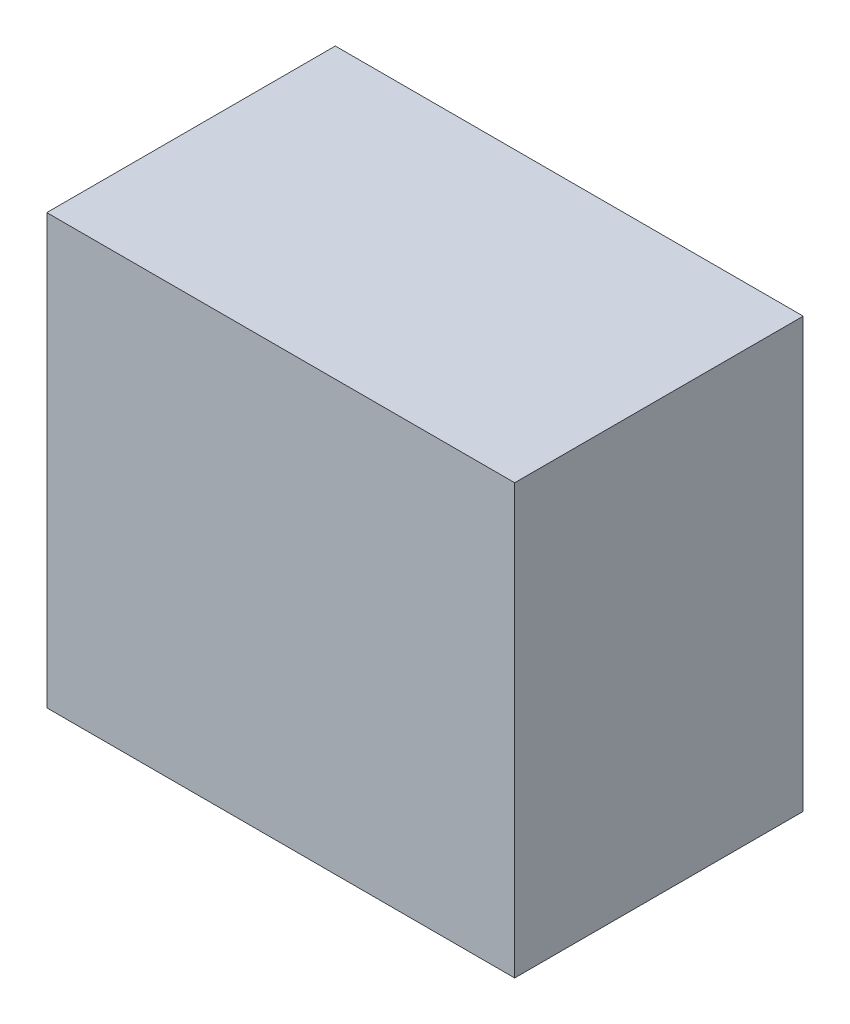
ISO-10303-21;
HEADER;
FILE_DESCRIPTION(('STEP AP214'),'2;1');
FILE_NAME('part.step','',(''),(''),'','','');
FILE_SCHEMA(('AUTOMOTIVE_DESIGN { 1 0 10303 214 1 1 1 1 }'));
ENDSEC;
DATA;
#1=APPLICATION_CONTEXT('core data for automotive mechanical design processes');
#2=APPLICATION_PROTOCOL_DEFINITION('international standard','automotive_design',2000,#1);
#3=PRODUCT_CONTEXT('',#1,'mechanical');
#4=PRODUCT('Part','Part','',(#3));
#5=PRODUCT_RELATED_PRODUCT_CATEGORY('part','',(#4));
#6=PRODUCT_DEFINITION_FORMATION('','',#4);
#7=PRODUCT_DEFINITION_CONTEXT('part definition',#1,'design');
#8=PRODUCT_DEFINITION('design','',#6,#7);
#9=PRODUCT_DEFINITION_SHAPE('','',#8);
#10=(LENGTH_UNIT() NAMED_UNIT(*) SI_UNIT(.MILLI.,.METRE.));
#11=(NAMED_UNIT(*) PLANE_ANGLE_UNIT() SI_UNIT($,.RADIAN.));
#12=(NAMED_UNIT(*) SI_UNIT($,.STERADIAN.) SOLID_ANGLE_UNIT());
#13=UNCERTAINTY_MEASURE_WITH_UNIT(LENGTH_MEASURE(1.E-05),#10,'distance_accuracy_value','');
#14=(GEOMETRIC_REPRESENTATION_CONTEXT(3) GLOBAL_UNCERTAINTY_ASSIGNED_CONTEXT((#13)) GLOBAL_UNIT_ASSIGNED_CONTEXT((#10,
#11,#12)) REPRESENTATION_CONTEXT('',''));
#15=CARTESIAN_POINT('',(0.,0.,0.));
#16=DIRECTION('',(0.,0.,1.));
#17=DIRECTION('',(1.,0.,0.));
#18=AXIS2_PLACEMENT_3D('',#15,#16,#17);
#19=CARTESIAN_POINT('',(0.,0.,370.));
#20=DIRECTION('',(1.,0.,0.));
#21=DIRECTION('',(0.,0.,-1.));
#22=AXIS2_PLACEMENT_3D('',#19,#20,#21);
#23=PLANE('',#22);
#24=DIRECTION('',(0.,-1.,0.));
#25=VECTOR('',#24,1.);
#26=CARTESIAN_POINT('',(0.,0.,0.));
#27=LINE('',#26,#25);
#28=CARTESIAN_POINT('',(0.,550.,0.));
#29=VERTEX_POINT('',#28);
#30=CARTESIAN_POINT('',(0.,0.,0.));
#31=VERTEX_POINT('',#30);
#32=EDGE_CURVE('E97',#29,#31,#27,.T.);
#33=ORIENTED_EDGE('',*,*,#32,.T.);
#34=DIRECTION('',(0.,0.,-1.));
#35=VECTOR('',#34,1.);
#36=CARTESIAN_POINT('',(0.,0.,370.));
#37=LINE('',#36,#35);
#38=CARTESIAN_POINT('',(0.,0.,370.));
#39=VERTEX_POINT('',#38);
#40=EDGE_CURVE('E11',#39,#31,#37,.T.);
#41=ORIENTED_EDGE('',*,*,#40,.F.);
#42=DIRECTION('',(0.,-1.,0.));
#43=VECTOR('',#42,1.);
#44=CARTESIAN_POINT('',(0.,0.,370.));
#45=LINE('',#44,#43);
#46=CARTESIAN_POINT('',(0.,550.,370.));
#47=VERTEX_POINT('',#46);
#48=EDGE_CURVE('E85',#47,#39,#45,.T.);
#49=ORIENTED_EDGE('',*,*,#48,.F.);
#50=DIRECTION('',(0.,0.,-1.));
#51=VECTOR('',#50,1.);
#52=CARTESIAN_POINT('',(0.,550.,370.));
#53=LINE('',#52,#51);
#54=EDGE_CURVE('E93',#47,#29,#53,.T.);
#55=ORIENTED_EDGE('',*,*,#54,.T.);
#56=EDGE_LOOP('',(#33,#41,#49,#55));
#57=FACE_BOUND('',#56,.T.);
#58=ADVANCED_FACE('F34',(#57),#23,.F.);
#59=CARTESIAN_POINT('',(0.,0.,370.));
#60=DIRECTION('',(0.,1.,0.));
#61=DIRECTION('',(0.,0.,1.));
#62=AXIS2_PLACEMENT_3D('',#59,#60,#61);
#63=PLANE('',#62);
#64=DIRECTION('',(1.,0.,0.));
#65=VECTOR('',#64,1.);
#66=CARTESIAN_POINT('',(0.,0.,0.));
#67=LINE('',#66,#65);
#68=CARTESIAN_POINT('',(600.,0.,0.));
#69=VERTEX_POINT('',#68);
#70=EDGE_CURVE('E89',#31,#69,#67,.T.);
#71=ORIENTED_EDGE('',*,*,#70,.T.);
#72=DIRECTION('',(0.,0.,-1.));
#73=VECTOR('',#72,1.);
#74=CARTESIAN_POINT('',(600.,0.,370.));
#75=LINE('',#74,#73);
#76=CARTESIAN_POINT('',(600.,0.,370.));
#77=VERTEX_POINT('',#76);
#78=EDGE_CURVE('E42',#77,#69,#75,.T.);
#79=ORIENTED_EDGE('',*,*,#78,.F.);
#80=DIRECTION('',(1.,0.,0.));
#81=VECTOR('',#80,1.);
#82=CARTESIAN_POINT('',(0.,0.,370.));
#83=LINE('',#82,#81);
#84=EDGE_CURVE('E80',#39,#77,#83,.T.);
#85=ORIENTED_EDGE('',*,*,#84,.F.);
#86=ORIENTED_EDGE('',*,*,#40,.T.);
#87=EDGE_LOOP('',(#71,#79,#85,#86));
#88=FACE_BOUND('',#87,.T.);
#89=ADVANCED_FACE('F88',(#88),#63,.F.);
#90=CARTESIAN_POINT('',(600.,0.,370.));
#91=DIRECTION('',(-1.,0.,0.));
#92=DIRECTION('',(0.,0.,1.));
#93=AXIS2_PLACEMENT_3D('',#90,#91,#92);
#94=PLANE('',#93);
#95=DIRECTION('',(0.,1.,0.));
#96=VECTOR('',#95,1.);
#97=CARTESIAN_POINT('',(600.,0.,0.));
#98=LINE('',#97,#96);
#99=CARTESIAN_POINT('',(600.,550.,0.));
#100=VERTEX_POINT('',#99);
#101=EDGE_CURVE('E67',#69,#100,#98,.T.);
#102=ORIENTED_EDGE('',*,*,#101,.T.);
#103=DIRECTION('',(0.,0.,-1.));
#104=VECTOR('',#103,1.);
#105=CARTESIAN_POINT('',(600.,550.,370.));
#106=LINE('',#105,#104);
#107=CARTESIAN_POINT('',(600.,550.,370.));
#108=VERTEX_POINT('',#107);
#109=EDGE_CURVE('E90',#108,#100,#106,.T.);
#110=ORIENTED_EDGE('',*,*,#109,.F.);
#111=DIRECTION('',(0.,1.,0.));
#112=VECTOR('',#111,1.);
#113=CARTESIAN_POINT('',(600.,0.,370.));
#114=LINE('',#113,#112);
#115=EDGE_CURVE('E83',#77,#108,#114,.T.);
#116=ORIENTED_EDGE('',*,*,#115,.F.);
#117=ORIENTED_EDGE('',*,*,#78,.T.);
#118=EDGE_LOOP('',(#102,#110,#116,#117));
#119=FACE_BOUND('',#118,.T.);
#120=ADVANCED_FACE('F91',(#119),#94,.F.);
#121=CARTESIAN_POINT('',(0.,550.,370.));
#122=DIRECTION('',(0.,-1.,0.));
#123=DIRECTION('',(0.,0.,-1.));
#124=AXIS2_PLACEMENT_3D('',#121,#122,#123);
#125=PLANE('',#124);
#126=DIRECTION('',(-1.,0.,0.));
#127=VECTOR('',#126,1.);
#128=CARTESIAN_POINT('',(0.,550.,0.));
#129=LINE('',#128,#127);
#130=EDGE_CURVE('E73',#100,#29,#129,.T.);
#131=ORIENTED_EDGE('',*,*,#130,.T.);
#132=ORIENTED_EDGE('',*,*,#54,.F.);
#133=DIRECTION('',(-1.,0.,0.));
#134=VECTOR('',#133,1.);
#135=CARTESIAN_POINT('',(0.,550.,370.));
#136=LINE('',#135,#134);
#137=EDGE_CURVE('E50',#108,#47,#136,.T.);
#138=ORIENTED_EDGE('',*,*,#137,.F.);
#139=ORIENTED_EDGE('',*,*,#109,.T.);
#140=EDGE_LOOP('',(#131,#132,#138,#139));
#141=FACE_BOUND('',#140,.T.);
#142=ADVANCED_FACE('F104',(#141),#125,.F.);
#143=CARTESIAN_POINT('',(0.,0.,370.));
#144=DIRECTION('',(0.,0.,-1.));
#145=DIRECTION('',(-1.,0.,0.));
#146=AXIS2_PLACEMENT_3D('',#143,#144,#145);
#147=PLANE('',#146);
#148=ORIENTED_EDGE('',*,*,#48,.T.);
#149=ORIENTED_EDGE('',*,*,#84,.T.);
#150=ORIENTED_EDGE('',*,*,#115,.T.);
#151=ORIENTED_EDGE('',*,*,#137,.T.);
#152=EDGE_LOOP('',(#148,#149,#150,#151));
#153=FACE_BOUND('',#152,.T.);
#154=ADVANCED_FACE('F81',(#153),#147,.F.);
#155=CARTESIAN_POINT('',(0.,0.,0.));
#156=DIRECTION('',(0.,0.,-1.));
#157=DIRECTION('',(-1.,0.,0.));
#158=AXIS2_PLACEMENT_3D('',#155,#156,#157);
#159=PLANE('',#158);
#160=ORIENTED_EDGE('',*,*,#32,.F.);
#161=ORIENTED_EDGE('',*,*,#130,.F.);
#162=ORIENTED_EDGE('',*,*,#101,.F.);
#163=ORIENTED_EDGE('',*,*,#70,.F.);
#164=EDGE_LOOP('',(#160,#161,#162,#163));
#165=FACE_BOUND('',#164,.T.);
#166=ADVANCED_FACE('F107',(#165),#159,.T.);
#167=CLOSED_SHELL('',(#58,#89,#120,#142,#154,#166));
#168=MANIFOLD_SOLID_BREP('B2',#167);
#169=ADVANCED_BREP_SHAPE_REPRESENTATION('',(#18,#168),#14);
#170=SHAPE_DEFINITION_REPRESENTATION(#9,#169);
ENDSEC;
END-ISO-10303-21;
